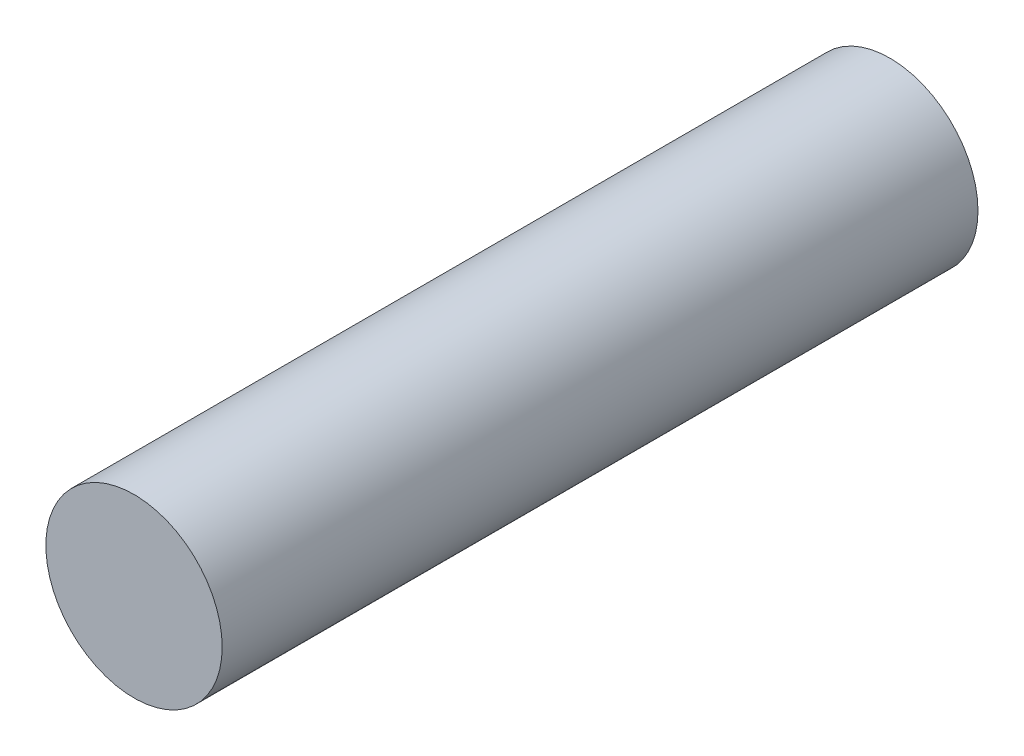
ISO-10303-21;
HEADER;
FILE_DESCRIPTION(('STEP AP214'),'2;1');
FILE_NAME('part.step','',(''),(''),'','','');
FILE_SCHEMA(('AUTOMOTIVE_DESIGN { 1 0 10303 214 1 1 1 1 }'));
ENDSEC;
DATA;
#1=APPLICATION_CONTEXT('core data for automotive mechanical design processes');
#2=APPLICATION_PROTOCOL_DEFINITION('international standard','automotive_design',2000,#1);
#3=PRODUCT_CONTEXT('',#1,'mechanical');
#4=PRODUCT('Part','Part','',(#3));
#5=PRODUCT_RELATED_PRODUCT_CATEGORY('part','',(#4));
#6=PRODUCT_DEFINITION_FORMATION('','',#4);
#7=PRODUCT_DEFINITION_CONTEXT('part definition',#1,'design');
#8=PRODUCT_DEFINITION('design','',#6,#7);
#9=PRODUCT_DEFINITION_SHAPE('','',#8);
#10=(LENGTH_UNIT() NAMED_UNIT(*) SI_UNIT(.MILLI.,.METRE.));
#11=(NAMED_UNIT(*) PLANE_ANGLE_UNIT() SI_UNIT($,.RADIAN.));
#12=(NAMED_UNIT(*) SI_UNIT($,.STERADIAN.) SOLID_ANGLE_UNIT());
#13=UNCERTAINTY_MEASURE_WITH_UNIT(LENGTH_MEASURE(1.E-05),#10,'distance_accuracy_value','');
#14=(GEOMETRIC_REPRESENTATION_CONTEXT(3) GLOBAL_UNCERTAINTY_ASSIGNED_CONTEXT((#13)) GLOBAL_UNIT_ASSIGNED_CONTEXT((#10,
#11,#12)) REPRESENTATION_CONTEXT('',''));
#15=CARTESIAN_POINT('',(0.,0.,0.));
#16=DIRECTION('',(0.,0.,1.));
#17=DIRECTION('',(1.,0.,0.));
#18=AXIS2_PLACEMENT_3D('',#15,#16,#17);
#19=CARTESIAN_POINT('',(0.,0.,15.));
#20=DIRECTION('',(0.,0.,-1.));
#21=DIRECTION('',(-1.,0.,0.));
#22=AXIS2_PLACEMENT_3D('',#19,#20,#21);
#23=CYLINDRICAL_SURFACE('',#22,1.75);
#24=CARTESIAN_POINT('',(0.,0.,15.));
#25=DIRECTION('',(0.,0.,1.));
#26=DIRECTION('',(1.,0.,0.));
#27=AXIS2_PLACEMENT_3D('',#24,#25,#26);
#28=CIRCLE('',#27,1.75);
#29=CARTESIAN_POINT('',(1.75,0.,15.));
#30=VERTEX_POINT('',#29);
#31=EDGE_CURVE('E10',#30,#30,#28,.T.);
#32=ORIENTED_EDGE('',*,*,#31,.F.);
#33=EDGE_LOOP('',(#32));
#34=FACE_BOUND('',#33,.T.);
#35=CARTESIAN_POINT('',(0.,0.,0.));
#36=DIRECTION('',(0.,0.,1.));
#37=DIRECTION('',(1.,0.,0.));
#38=AXIS2_PLACEMENT_3D('',#35,#36,#37);
#39=CIRCLE('',#38,1.75);
#40=CARTESIAN_POINT('',(1.75,0.,0.));
#41=VERTEX_POINT('',#40);
#42=EDGE_CURVE('E34',#41,#41,#39,.T.);
#43=ORIENTED_EDGE('',*,*,#42,.T.);
#44=EDGE_LOOP('',(#43));
#45=FACE_BOUND('',#44,.T.);
#46=ADVANCED_FACE('F31',(#34,#45),#23,.T.);
#47=CARTESIAN_POINT('',(0.,0.,15.));
#48=DIRECTION('',(0.,0.,1.));
#49=DIRECTION('',(1.,0.,0.));
#50=AXIS2_PLACEMENT_3D('',#47,#48,#49);
#51=PLANE('',#50);
#52=ORIENTED_EDGE('',*,*,#31,.T.);
#53=EDGE_LOOP('',(#52));
#54=FACE_BOUND('',#53,.T.);
#55=ADVANCED_FACE('F46',(#54),#51,.T.);
#56=CARTESIAN_POINT('',(0.,0.,0.));
#57=DIRECTION('',(0.,0.,1.));
#58=DIRECTION('',(1.,0.,0.));
#59=AXIS2_PLACEMENT_3D('',#56,#57,#58);
#60=PLANE('',#59);
#61=ORIENTED_EDGE('',*,*,#42,.F.);
#62=EDGE_LOOP('',(#61));
#63=FACE_BOUND('',#62,.T.);
#64=ADVANCED_FACE('F44',(#63),#60,.F.);
#65=CLOSED_SHELL('',(#46,#55,#64));
#66=MANIFOLD_SOLID_BREP('B2',#65);
#67=ADVANCED_BREP_SHAPE_REPRESENTATION('',(#18,#66),#14);
#68=SHAPE_DEFINITION_REPRESENTATION(#9,#67);
ENDSEC;
END-ISO-10303-21;
